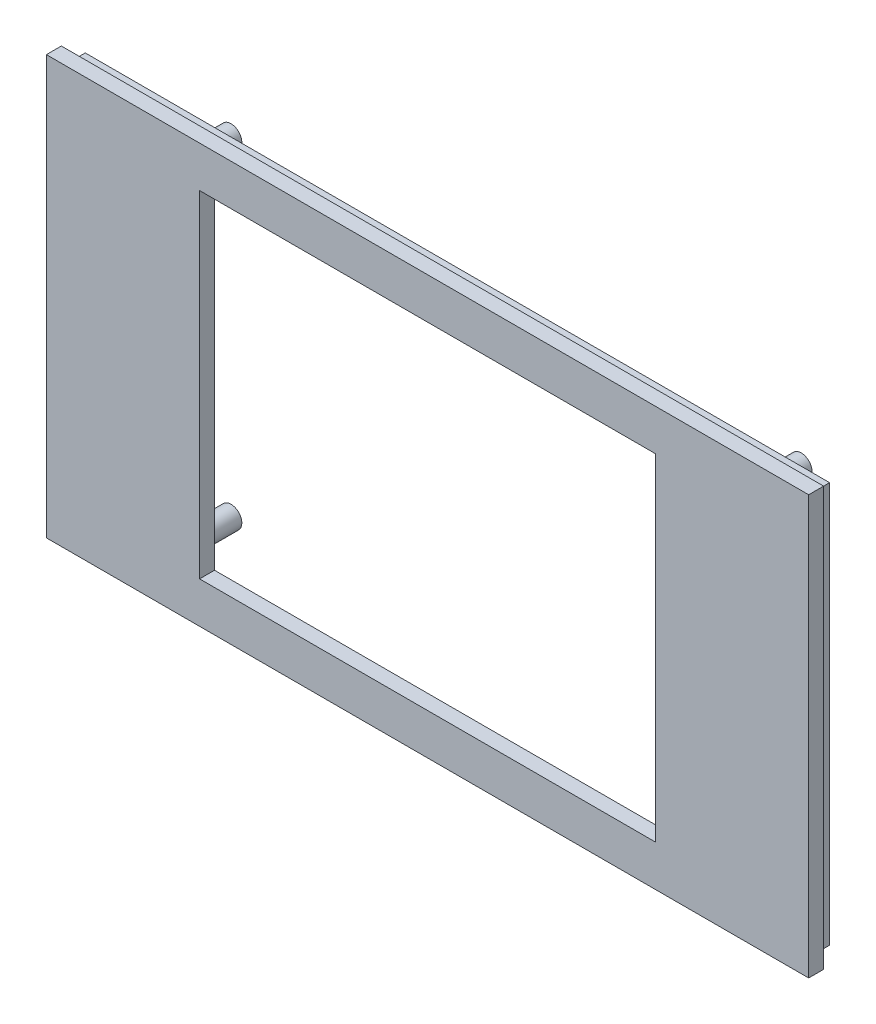
ISO-10303-21;
HEADER;
FILE_DESCRIPTION(('STEP AP214'),'2;1');
FILE_NAME('part.step','',(''),(''),'','','');
FILE_SCHEMA(('AUTOMOTIVE_DESIGN { 1 0 10303 214 1 1 1 1 }'));
ENDSEC;
DATA;
#1=APPLICATION_CONTEXT('core data for automotive mechanical design processes');
#2=APPLICATION_PROTOCOL_DEFINITION('international standard','automotive_design',2000,#1);
#3=PRODUCT_CONTEXT('',#1,'mechanical');
#4=PRODUCT('Part','Part','',(#3));
#5=PRODUCT_RELATED_PRODUCT_CATEGORY('part','',(#4));
#6=PRODUCT_DEFINITION_FORMATION('','',#4);
#7=PRODUCT_DEFINITION_CONTEXT('part definition',#1,'design');
#8=PRODUCT_DEFINITION('design','',#6,#7);
#9=PRODUCT_DEFINITION_SHAPE('','',#8);
#10=(LENGTH_UNIT() NAMED_UNIT(*) SI_UNIT(.MILLI.,.METRE.));
#11=(NAMED_UNIT(*) PLANE_ANGLE_UNIT() SI_UNIT($,.RADIAN.));
#12=(NAMED_UNIT(*) SI_UNIT($,.STERADIAN.) SOLID_ANGLE_UNIT());
#13=UNCERTAINTY_MEASURE_WITH_UNIT(LENGTH_MEASURE(1.E-05),#10,'distance_accuracy_value','');
#14=(GEOMETRIC_REPRESENTATION_CONTEXT(3) GLOBAL_UNCERTAINTY_ASSIGNED_CONTEXT((#13)) GLOBAL_UNIT_ASSIGNED_CONTEXT((#10,
#11,#12)) REPRESENTATION_CONTEXT('',''));
#15=CARTESIAN_POINT('',(0.,0.,0.));
#16=DIRECTION('',(0.,0.,1.));
#17=DIRECTION('',(1.,0.,0.));
#18=AXIS2_PLACEMENT_3D('',#15,#16,#17);
#19=CARTESIAN_POINT('',(0.,0.,0.));
#20=DIRECTION('',(0.,0.,-1.));
#21=DIRECTION('',(-1.,0.,0.));
#22=AXIS2_PLACEMENT_3D('',#19,#20,#21);
#23=PLANE('',#22);
#24=DIRECTION('',(0.,1.,0.));
#25=VECTOR('',#24,1.);
#26=CARTESIAN_POINT('',(51.,-28.,0.));
#27=LINE('',#26,#25);
#28=CARTESIAN_POINT('',(51.,-28.,0.));
#29=VERTEX_POINT('',#28);
#30=CARTESIAN_POINT('',(51.,28.,0.));
#31=VERTEX_POINT('',#30);
#32=EDGE_CURVE('E246',#29,#31,#27,.T.);
#33=ORIENTED_EDGE('',*,*,#32,.F.);
#34=DIRECTION('',(1.,0.,0.));
#35=VECTOR('',#34,1.);
#36=CARTESIAN_POINT('',(-51.,-28.,0.));
#37=LINE('',#36,#35);
#38=CARTESIAN_POINT('',(-51.,-28.,0.));
#39=VERTEX_POINT('',#38);
#40=EDGE_CURVE('E251',#39,#29,#37,.T.);
#41=ORIENTED_EDGE('',*,*,#40,.F.);
#42=DIRECTION('',(0.,-1.,0.));
#43=VECTOR('',#42,1.);
#44=CARTESIAN_POINT('',(-51.,-28.,0.));
#45=LINE('',#44,#43);
#46=CARTESIAN_POINT('',(-51.,28.,0.));
#47=VERTEX_POINT('',#46);
#48=EDGE_CURVE('E262',#47,#39,#45,.T.);
#49=ORIENTED_EDGE('',*,*,#48,.F.);
#50=DIRECTION('',(-1.,0.,0.));
#51=VECTOR('',#50,1.);
#52=CARTESIAN_POINT('',(-51.,28.,0.));
#53=LINE('',#52,#51);
#54=EDGE_CURVE('E260',#31,#47,#53,.T.);
#55=ORIENTED_EDGE('',*,*,#54,.F.);
#56=EDGE_LOOP('',(#33,#41,#49,#55));
#57=FACE_BOUND('',#56,.T.);
#58=DIRECTION('',(-1.,0.,0.));
#59=VECTOR('',#58,1.);
#60=CARTESIAN_POINT('',(49.8,-26.8,0.));
#61=LINE('',#60,#59);
#62=CARTESIAN_POINT('',(49.8,-26.8,0.));
#63=VERTEX_POINT('',#62);
#64=CARTESIAN_POINT('',(-49.8,-26.8,0.));
#65=VERTEX_POINT('',#64);
#66=EDGE_CURVE('E202',#63,#65,#61,.T.);
#67=ORIENTED_EDGE('',*,*,#66,.F.);
#68=DIRECTION('',(0.,-1.,0.));
#69=VECTOR('',#68,1.);
#70=CARTESIAN_POINT('',(49.8,26.8,0.));
#71=LINE('',#70,#69);
#72=CARTESIAN_POINT('',(49.8,26.8,0.));
#73=VERTEX_POINT('',#72);
#74=EDGE_CURVE('E165',#73,#63,#71,.T.);
#75=ORIENTED_EDGE('',*,*,#74,.F.);
#76=DIRECTION('',(1.,0.,0.));
#77=VECTOR('',#76,1.);
#78=CARTESIAN_POINT('',(49.8,26.8,0.));
#79=LINE('',#78,#77);
#80=CARTESIAN_POINT('',(-49.8,26.8,0.));
#81=VERTEX_POINT('',#80);
#82=EDGE_CURVE('E193',#81,#73,#79,.T.);
#83=ORIENTED_EDGE('',*,*,#82,.F.);
#84=DIRECTION('',(0.,1.,0.));
#85=VECTOR('',#84,1.);
#86=CARTESIAN_POINT('',(-49.8,26.8,0.));
#87=LINE('',#86,#85);
#88=EDGE_CURVE('E204',#65,#81,#87,.T.);
#89=ORIENTED_EDGE('',*,*,#88,.F.);
#90=EDGE_LOOP('',(#67,#75,#83,#89));
#91=FACE_BOUND('',#90,.T.);
#92=ADVANCED_FACE('F33',(#57,#91),#23,.T.);
#93=CARTESIAN_POINT('',(0.,0.,2.));
#94=DIRECTION('',(0.,0.,-1.));
#95=DIRECTION('',(-1.,0.,0.));
#96=AXIS2_PLACEMENT_3D('',#93,#94,#95);
#97=PLANE('',#96);
#98=DIRECTION('',(0.,1.,0.));
#99=VECTOR('',#98,1.);
#100=CARTESIAN_POINT('',(51.,-28.,2.));
#101=LINE('',#100,#99);
#102=CARTESIAN_POINT('',(51.,-28.,2.));
#103=VERTEX_POINT('',#102);
#104=CARTESIAN_POINT('',(51.,28.,2.));
#105=VERTEX_POINT('',#104);
#106=EDGE_CURVE('E247',#103,#105,#101,.T.);
#107=ORIENTED_EDGE('',*,*,#106,.T.);
#108=DIRECTION('',(-1.,0.,0.));
#109=VECTOR('',#108,1.);
#110=CARTESIAN_POINT('',(-51.,28.,2.));
#111=LINE('',#110,#109);
#112=CARTESIAN_POINT('',(-51.,28.,2.));
#113=VERTEX_POINT('',#112);
#114=EDGE_CURVE('E250',#105,#113,#111,.T.);
#115=ORIENTED_EDGE('',*,*,#114,.T.);
#116=DIRECTION('',(0.,-1.,0.));
#117=VECTOR('',#116,1.);
#118=CARTESIAN_POINT('',(-51.,-28.,2.));
#119=LINE('',#118,#117);
#120=CARTESIAN_POINT('',(-51.,-28.,2.));
#121=VERTEX_POINT('',#120);
#122=EDGE_CURVE('E253',#113,#121,#119,.T.);
#123=ORIENTED_EDGE('',*,*,#122,.T.);
#124=DIRECTION('',(1.,0.,0.));
#125=VECTOR('',#124,1.);
#126=CARTESIAN_POINT('',(-51.,-28.,2.));
#127=LINE('',#126,#125);
#128=EDGE_CURVE('E255',#121,#103,#127,.T.);
#129=ORIENTED_EDGE('',*,*,#128,.T.);
#130=EDGE_LOOP('',(#107,#115,#123,#129));
#131=FACE_BOUND('',#130,.T.);
#132=DIRECTION('',(0.,1.,0.));
#133=VECTOR('',#132,1.);
#134=CARTESIAN_POINT('',(30.5,-22.5,2.));
#135=LINE('',#134,#133);
#136=CARTESIAN_POINT('',(30.5,-22.5,2.));
#137=VERTEX_POINT('',#136);
#138=CARTESIAN_POINT('',(30.5,22.5,2.));
#139=VERTEX_POINT('',#138);
#140=EDGE_CURVE('E216',#137,#139,#135,.T.);
#141=ORIENTED_EDGE('',*,*,#140,.F.);
#142=DIRECTION('',(1.,0.,0.));
#143=VECTOR('',#142,1.);
#144=CARTESIAN_POINT('',(-30.5,-22.5,2.));
#145=LINE('',#144,#143);
#146=CARTESIAN_POINT('',(-30.5,-22.5,2.));
#147=VERTEX_POINT('',#146);
#148=EDGE_CURVE('E224',#147,#137,#145,.T.);
#149=ORIENTED_EDGE('',*,*,#148,.F.);
#150=DIRECTION('',(0.,-1.,0.));
#151=VECTOR('',#150,1.);
#152=CARTESIAN_POINT('',(-30.5,-22.5,2.));
#153=LINE('',#152,#151);
#154=CARTESIAN_POINT('',(-30.5,22.5,2.));
#155=VERTEX_POINT('',#154);
#156=EDGE_CURVE('E221',#155,#147,#153,.T.);
#157=ORIENTED_EDGE('',*,*,#156,.F.);
#158=DIRECTION('',(-1.,0.,0.));
#159=VECTOR('',#158,1.);
#160=CARTESIAN_POINT('',(-30.5,22.5,2.));
#161=LINE('',#160,#159);
#162=EDGE_CURVE('E218',#139,#155,#161,.T.);
#163=ORIENTED_EDGE('',*,*,#162,.F.);
#164=EDGE_LOOP('',(#141,#149,#157,#163));
#165=FACE_BOUND('',#164,.T.);
#166=ADVANCED_FACE('F289',(#131,#165),#97,.F.);
#167=CARTESIAN_POINT('',(-35.3,-22.2,0.));
#168=DIRECTION('',(0.,0.,-1.));
#169=DIRECTION('',(-1.,0.,0.));
#170=AXIS2_PLACEMENT_3D('',#167,#168,#169);
#171=CIRCLE('',#170,1.45);
#172=CARTESIAN_POINT('',(-36.75,-22.2,0.));
#173=VERTEX_POINT('',#172);
#174=EDGE_CURVE('E313',#173,#173,#171,.T.);
#175=ORIENTED_EDGE('',*,*,#174,.F.);
#176=EDGE_LOOP('',(#175));
#177=FACE_BOUND('',#176,.T.);
#178=CARTESIAN_POINT('',(41.,-22.2,0.));
#179=DIRECTION('',(0.,0.,-1.));
#180=DIRECTION('',(-1.,0.,0.));
#181=AXIS2_PLACEMENT_3D('',#178,#179,#180);
#182=CIRCLE('',#181,1.45);
#183=CARTESIAN_POINT('',(39.55,-22.2,0.));
#184=VERTEX_POINT('',#183);
#185=EDGE_CURVE('E317',#184,#184,#182,.T.);
#186=ORIENTED_EDGE('',*,*,#185,.F.);
#187=EDGE_LOOP('',(#186));
#188=FACE_BOUND('',#187,.T.);
#189=CARTESIAN_POINT('',(-35.3,21.9,0.));
#190=DIRECTION('',(0.,0.,-1.));
#191=DIRECTION('',(-1.,0.,0.));
#192=AXIS2_PLACEMENT_3D('',#189,#190,#191);
#193=CIRCLE('',#192,1.45);
#194=CARTESIAN_POINT('',(-36.75,21.9,0.));
#195=VERTEX_POINT('',#194);
#196=EDGE_CURVE('E321',#195,#195,#193,.T.);
#197=ORIENTED_EDGE('',*,*,#196,.F.);
#198=EDGE_LOOP('',(#197));
#199=FACE_BOUND('',#198,.T.);
#200=CARTESIAN_POINT('',(41.,21.9,0.));
#201=DIRECTION('',(0.,0.,-1.));
#202=DIRECTION('',(-1.,0.,0.));
#203=AXIS2_PLACEMENT_3D('',#200,#201,#202);
#204=CIRCLE('',#203,1.45);
#205=CARTESIAN_POINT('',(39.55,21.9,0.));
#206=VERTEX_POINT('',#205);
#207=EDGE_CURVE('E324',#206,#206,#204,.T.);
#208=ORIENTED_EDGE('',*,*,#207,.F.);
#209=EDGE_LOOP('',(#208));
#210=FACE_BOUND('',#209,.T.);
#211=DIRECTION('',(0.,1.,0.));
#212=VECTOR('',#211,1.);
#213=CARTESIAN_POINT('',(-48.6,25.6,0.));
#214=LINE('',#213,#212);
#215=CARTESIAN_POINT('',(-48.6,-25.6,0.));
#216=VERTEX_POINT('',#215);
#217=CARTESIAN_POINT('',(-48.6,25.6,0.));
#218=VERTEX_POINT('',#217);
#219=EDGE_CURVE('E56',#216,#218,#214,.T.);
#220=ORIENTED_EDGE('',*,*,#219,.T.);
#221=DIRECTION('',(1.,0.,0.));
#222=VECTOR('',#221,1.);
#223=CARTESIAN_POINT('',(-48.6,25.6,0.));
#224=LINE('',#223,#222);
#225=CARTESIAN_POINT('',(48.6,25.6,0.));
#226=VERTEX_POINT('',#225);
#227=EDGE_CURVE('E164',#218,#226,#224,.T.);
#228=ORIENTED_EDGE('',*,*,#227,.T.);
#229=DIRECTION('',(0.,-1.,0.));
#230=VECTOR('',#229,1.);
#231=CARTESIAN_POINT('',(48.6,25.6,0.));
#232=LINE('',#231,#230);
#233=CARTESIAN_POINT('',(48.6,-25.6,0.));
#234=VERTEX_POINT('',#233);
#235=EDGE_CURVE('E181',#226,#234,#232,.T.);
#236=ORIENTED_EDGE('',*,*,#235,.T.);
#237=DIRECTION('',(-1.,0.,0.));
#238=VECTOR('',#237,1.);
#239=CARTESIAN_POINT('',(-48.6,-25.6,0.));
#240=LINE('',#239,#238);
#241=EDGE_CURVE('E158',#234,#216,#240,.T.);
#242=ORIENTED_EDGE('',*,*,#241,.T.);
#243=EDGE_LOOP('',(#220,#228,#236,#242));
#244=FACE_BOUND('',#243,.T.);
#245=DIRECTION('',(1.,0.,0.));
#246=VECTOR('',#245,1.);
#247=CARTESIAN_POINT('',(-30.5,-22.5,0.));
#248=LINE('',#247,#246);
#249=CARTESIAN_POINT('',(-30.5,-22.5,0.));
#250=VERTEX_POINT('',#249);
#251=CARTESIAN_POINT('',(30.5,-22.5,0.));
#252=VERTEX_POINT('',#251);
#253=EDGE_CURVE('E219',#250,#252,#248,.T.);
#254=ORIENTED_EDGE('',*,*,#253,.T.);
#255=DIRECTION('',(0.,1.,0.));
#256=VECTOR('',#255,1.);
#257=CARTESIAN_POINT('',(30.5,-22.5,0.));
#258=LINE('',#257,#256);
#259=CARTESIAN_POINT('',(30.5,22.5,0.));
#260=VERTEX_POINT('',#259);
#261=EDGE_CURVE('E215',#252,#260,#258,.T.);
#262=ORIENTED_EDGE('',*,*,#261,.T.);
#263=DIRECTION('',(-1.,0.,0.));
#264=VECTOR('',#263,1.);
#265=CARTESIAN_POINT('',(-30.5,22.5,0.));
#266=LINE('',#265,#264);
#267=CARTESIAN_POINT('',(-30.5,22.5,0.));
#268=VERTEX_POINT('',#267);
#269=EDGE_CURVE('E229',#260,#268,#266,.T.);
#270=ORIENTED_EDGE('',*,*,#269,.T.);
#271=DIRECTION('',(0.,-1.,0.));
#272=VECTOR('',#271,1.);
#273=CARTESIAN_POINT('',(-30.5,-22.5,0.));
#274=LINE('',#273,#272);
#275=EDGE_CURVE('E232',#268,#250,#274,.T.);
#276=ORIENTED_EDGE('',*,*,#275,.T.);
#277=EDGE_LOOP('',(#254,#262,#270,#276));
#278=FACE_BOUND('',#277,.T.);
#279=ADVANCED_FACE('F298',(#177,#188,#199,#210,#244,#278),#23,.T.);
#280=CARTESIAN_POINT('',(51.,-28.,2.));
#281=DIRECTION('',(-1.,0.,0.));
#282=DIRECTION('',(0.,0.,1.));
#283=AXIS2_PLACEMENT_3D('',#280,#281,#282);
#284=PLANE('',#283);
#285=ORIENTED_EDGE('',*,*,#32,.T.);
#286=DIRECTION('',(0.,0.,-1.));
#287=VECTOR('',#286,1.);
#288=CARTESIAN_POINT('',(51.,28.,2.));
#289=LINE('',#288,#287);
#290=EDGE_CURVE('E11',#105,#31,#289,.T.);
#291=ORIENTED_EDGE('',*,*,#290,.F.);
#292=ORIENTED_EDGE('',*,*,#106,.F.);
#293=DIRECTION('',(0.,0.,-1.));
#294=VECTOR('',#293,1.);
#295=CARTESIAN_POINT('',(51.,-28.,2.));
#296=LINE('',#295,#294);
#297=EDGE_CURVE('E257',#103,#29,#296,.T.);
#298=ORIENTED_EDGE('',*,*,#297,.T.);
#299=EDGE_LOOP('',(#285,#291,#292,#298));
#300=FACE_BOUND('',#299,.T.);
#301=ADVANCED_FACE('F35',(#300),#284,.F.);
#302=CARTESIAN_POINT('',(-51.,28.,2.));
#303=DIRECTION('',(0.,-1.,0.));
#304=DIRECTION('',(0.,0.,-1.));
#305=AXIS2_PLACEMENT_3D('',#302,#303,#304);
#306=PLANE('',#305);
#307=ORIENTED_EDGE('',*,*,#54,.T.);
#308=DIRECTION('',(0.,0.,-1.));
#309=VECTOR('',#308,1.);
#310=CARTESIAN_POINT('',(-51.,28.,2.));
#311=LINE('',#310,#309);
#312=EDGE_CURVE('E41',#113,#47,#311,.T.);
#313=ORIENTED_EDGE('',*,*,#312,.F.);
#314=ORIENTED_EDGE('',*,*,#114,.F.);
#315=ORIENTED_EDGE('',*,*,#290,.T.);
#316=EDGE_LOOP('',(#307,#313,#314,#315));
#317=FACE_BOUND('',#316,.T.);
#318=ADVANCED_FACE('F291',(#317),#306,.F.);
#319=CARTESIAN_POINT('',(-51.,-28.,2.));
#320=DIRECTION('',(1.,0.,0.));
#321=DIRECTION('',(0.,0.,-1.));
#322=AXIS2_PLACEMENT_3D('',#319,#320,#321);
#323=PLANE('',#322);
#324=ORIENTED_EDGE('',*,*,#48,.T.);
#325=DIRECTION('',(0.,0.,-1.));
#326=VECTOR('',#325,1.);
#327=CARTESIAN_POINT('',(-51.,-28.,2.));
#328=LINE('',#327,#326);
#329=EDGE_CURVE('E267',#121,#39,#328,.T.);
#330=ORIENTED_EDGE('',*,*,#329,.F.);
#331=ORIENTED_EDGE('',*,*,#122,.F.);
#332=ORIENTED_EDGE('',*,*,#312,.T.);
#333=EDGE_LOOP('',(#324,#330,#331,#332));
#334=FACE_BOUND('',#333,.T.);
#335=ADVANCED_FACE('F274',(#334),#323,.F.);
#336=CARTESIAN_POINT('',(-51.,-28.,2.));
#337=DIRECTION('',(0.,1.,0.));
#338=DIRECTION('',(0.,0.,1.));
#339=AXIS2_PLACEMENT_3D('',#336,#337,#338);
#340=PLANE('',#339);
#341=ORIENTED_EDGE('',*,*,#40,.T.);
#342=ORIENTED_EDGE('',*,*,#297,.F.);
#343=ORIENTED_EDGE('',*,*,#128,.F.);
#344=ORIENTED_EDGE('',*,*,#329,.T.);
#345=EDGE_LOOP('',(#341,#342,#343,#344));
#346=FACE_BOUND('',#345,.T.);
#347=ADVANCED_FACE('F283',(#346),#340,.F.);
#348=CARTESIAN_POINT('',(30.5,-22.5,2.));
#349=DIRECTION('',(-1.,0.,0.));
#350=DIRECTION('',(0.,0.,1.));
#351=AXIS2_PLACEMENT_3D('',#348,#349,#350);
#352=PLANE('',#351);
#353=ORIENTED_EDGE('',*,*,#261,.F.);
#354=DIRECTION('',(0.,0.,-1.));
#355=VECTOR('',#354,1.);
#356=CARTESIAN_POINT('',(30.5,-22.5,2.));
#357=LINE('',#356,#355);
#358=EDGE_CURVE('E226',#137,#252,#357,.T.);
#359=ORIENTED_EDGE('',*,*,#358,.F.);
#360=ORIENTED_EDGE('',*,*,#140,.T.);
#361=DIRECTION('',(0.,0.,-1.));
#362=VECTOR('',#361,1.);
#363=CARTESIAN_POINT('',(30.5,22.5,2.));
#364=LINE('',#363,#362);
#365=EDGE_CURVE('E243',#139,#260,#364,.T.);
#366=ORIENTED_EDGE('',*,*,#365,.T.);
#367=EDGE_LOOP('',(#353,#359,#360,#366));
#368=FACE_BOUND('',#367,.T.);
#369=ADVANCED_FACE('F334',(#368),#352,.T.);
#370=CARTESIAN_POINT('',(-30.5,22.5,2.));
#371=DIRECTION('',(0.,-1.,0.));
#372=DIRECTION('',(0.,0.,-1.));
#373=AXIS2_PLACEMENT_3D('',#370,#371,#372);
#374=PLANE('',#373);
#375=ORIENTED_EDGE('',*,*,#269,.F.);
#376=ORIENTED_EDGE('',*,*,#365,.F.);
#377=ORIENTED_EDGE('',*,*,#162,.T.);
#378=DIRECTION('',(0.,0.,-1.));
#379=VECTOR('',#378,1.);
#380=CARTESIAN_POINT('',(-30.5,22.5,2.));
#381=LINE('',#380,#379);
#382=EDGE_CURVE('E241',#155,#268,#381,.T.);
#383=ORIENTED_EDGE('',*,*,#382,.T.);
#384=EDGE_LOOP('',(#375,#376,#377,#383));
#385=FACE_BOUND('',#384,.T.);
#386=ADVANCED_FACE('F340',(#385),#374,.T.);
#387=CARTESIAN_POINT('',(-30.5,-22.5,2.));
#388=DIRECTION('',(1.,0.,0.));
#389=DIRECTION('',(0.,0.,-1.));
#390=AXIS2_PLACEMENT_3D('',#387,#388,#389);
#391=PLANE('',#390);
#392=ORIENTED_EDGE('',*,*,#275,.F.);
#393=ORIENTED_EDGE('',*,*,#382,.F.);
#394=ORIENTED_EDGE('',*,*,#156,.T.);
#395=DIRECTION('',(0.,0.,-1.));
#396=VECTOR('',#395,1.);
#397=CARTESIAN_POINT('',(-30.5,-22.5,2.));
#398=LINE('',#397,#396);
#399=EDGE_CURVE('E239',#147,#250,#398,.T.);
#400=ORIENTED_EDGE('',*,*,#399,.T.);
#401=EDGE_LOOP('',(#392,#393,#394,#400));
#402=FACE_BOUND('',#401,.T.);
#403=ADVANCED_FACE('F342',(#402),#391,.T.);
#404=CARTESIAN_POINT('',(-30.5,-22.5,2.));
#405=DIRECTION('',(0.,1.,0.));
#406=DIRECTION('',(0.,0.,1.));
#407=AXIS2_PLACEMENT_3D('',#404,#405,#406);
#408=PLANE('',#407);
#409=ORIENTED_EDGE('',*,*,#253,.F.);
#410=ORIENTED_EDGE('',*,*,#399,.F.);
#411=ORIENTED_EDGE('',*,*,#148,.T.);
#412=ORIENTED_EDGE('',*,*,#358,.T.);
#413=EDGE_LOOP('',(#409,#410,#411,#412));
#414=FACE_BOUND('',#413,.T.);
#415=ADVANCED_FACE('F329',(#414),#408,.T.);
#416=CARTESIAN_POINT('',(0.,0.,-2.));
#417=DIRECTION('',(0.,0.,-1.));
#418=DIRECTION('',(-1.,0.,0.));
#419=AXIS2_PLACEMENT_3D('',#416,#417,#418);
#420=PLANE('',#419);
#421=DIRECTION('',(0.,-1.,0.));
#422=VECTOR('',#421,1.);
#423=CARTESIAN_POINT('',(49.8,26.8,-2.));
#424=LINE('',#423,#422);
#425=CARTESIAN_POINT('',(49.8,26.8,-2.));
#426=VERTEX_POINT('',#425);
#427=CARTESIAN_POINT('',(49.8,-26.8,-2.));
#428=VERTEX_POINT('',#427);
#429=EDGE_CURVE('E189',#426,#428,#424,.T.);
#430=ORIENTED_EDGE('',*,*,#429,.T.);
#431=DIRECTION('',(-1.,0.,0.));
#432=VECTOR('',#431,1.);
#433=CARTESIAN_POINT('',(49.8,-26.8,-2.));
#434=LINE('',#433,#432);
#435=CARTESIAN_POINT('',(-49.8,-26.8,-2.));
#436=VERTEX_POINT('',#435);
#437=EDGE_CURVE('E192',#428,#436,#434,.T.);
#438=ORIENTED_EDGE('',*,*,#437,.T.);
#439=DIRECTION('',(0.,1.,0.));
#440=VECTOR('',#439,1.);
#441=CARTESIAN_POINT('',(-49.8,26.8,-2.));
#442=LINE('',#441,#440);
#443=CARTESIAN_POINT('',(-49.8,26.8,-2.));
#444=VERTEX_POINT('',#443);
#445=EDGE_CURVE('E195',#436,#444,#442,.T.);
#446=ORIENTED_EDGE('',*,*,#445,.T.);
#447=DIRECTION('',(1.,0.,0.));
#448=VECTOR('',#447,1.);
#449=CARTESIAN_POINT('',(49.8,26.8,-2.));
#450=LINE('',#449,#448);
#451=EDGE_CURVE('E197',#444,#426,#450,.T.);
#452=ORIENTED_EDGE('',*,*,#451,.T.);
#453=EDGE_LOOP('',(#430,#438,#446,#452));
#454=FACE_BOUND('',#453,.T.);
#455=DIRECTION('',(1.,0.,0.));
#456=VECTOR('',#455,1.);
#457=CARTESIAN_POINT('',(-48.6,25.6,-2.));
#458=LINE('',#457,#456);
#459=CARTESIAN_POINT('',(-48.6,25.6,-2.));
#460=VERTEX_POINT('',#459);
#461=CARTESIAN_POINT('',(48.6,25.6,-2.));
#462=VERTEX_POINT('',#461);
#463=EDGE_CURVE('E157',#460,#462,#458,.T.);
#464=ORIENTED_EDGE('',*,*,#463,.F.);
#465=DIRECTION('',(0.,1.,0.));
#466=VECTOR('',#465,1.);
#467=CARTESIAN_POINT('',(-48.6,25.6,-2.));
#468=LINE('',#467,#466);
#469=CARTESIAN_POINT('',(-48.6,-25.6,-2.));
#470=VERTEX_POINT('',#469);
#471=EDGE_CURVE('E148',#470,#460,#468,.T.);
#472=ORIENTED_EDGE('',*,*,#471,.F.);
#473=DIRECTION('',(-1.,0.,0.));
#474=VECTOR('',#473,1.);
#475=CARTESIAN_POINT('',(-48.6,-25.6,-2.));
#476=LINE('',#475,#474);
#477=CARTESIAN_POINT('',(48.6,-25.6,-2.));
#478=VERTEX_POINT('',#477);
#479=EDGE_CURVE('E173',#478,#470,#476,.T.);
#480=ORIENTED_EDGE('',*,*,#479,.F.);
#481=DIRECTION('',(0.,-1.,0.));
#482=VECTOR('',#481,1.);
#483=CARTESIAN_POINT('',(48.6,25.6,-2.));
#484=LINE('',#483,#482);
#485=EDGE_CURVE('E171',#462,#478,#484,.T.);
#486=ORIENTED_EDGE('',*,*,#485,.F.);
#487=EDGE_LOOP('',(#464,#472,#480,#486));
#488=FACE_BOUND('',#487,.T.);
#489=ADVANCED_FACE('F169',(#454,#488),#420,.T.);
#490=CARTESIAN_POINT('',(49.8,26.8,-2.));
#491=DIRECTION('',(-1.,0.,0.));
#492=DIRECTION('',(0.,-1.,0.));
#493=AXIS2_PLACEMENT_3D('',#490,#491,#492);
#494=PLANE('',#493);
#495=ORIENTED_EDGE('',*,*,#74,.T.);
#496=DIRECTION('',(0.,0.,1.));
#497=VECTOR('',#496,1.);
#498=CARTESIAN_POINT('',(49.8,-26.8,-2.));
#499=LINE('',#498,#497);
#500=EDGE_CURVE('E213',#428,#63,#499,.T.);
#501=ORIENTED_EDGE('',*,*,#500,.F.);
#502=ORIENTED_EDGE('',*,*,#429,.F.);
#503=DIRECTION('',(0.,0.,1.));
#504=VECTOR('',#503,1.);
#505=CARTESIAN_POINT('',(49.8,26.8,-2.));
#506=LINE('',#505,#504);
#507=EDGE_CURVE('E199',#426,#73,#506,.T.);
#508=ORIENTED_EDGE('',*,*,#507,.T.);
#509=EDGE_LOOP('',(#495,#501,#502,#508));
#510=FACE_BOUND('',#509,.T.);
#511=ADVANCED_FACE('F488',(#510),#494,.F.);
#512=CARTESIAN_POINT('',(49.8,-26.8,-2.));
#513=DIRECTION('',(0.,1.,0.));
#514=DIRECTION('',(0.,0.,1.));
#515=AXIS2_PLACEMENT_3D('',#512,#513,#514);
#516=PLANE('',#515);
#517=ORIENTED_EDGE('',*,*,#66,.T.);
#518=DIRECTION('',(0.,0.,1.));
#519=VECTOR('',#518,1.);
#520=CARTESIAN_POINT('',(-49.8,-26.8,-2.));
#521=LINE('',#520,#519);
#522=EDGE_CURVE('E210',#436,#65,#521,.T.);
#523=ORIENTED_EDGE('',*,*,#522,.F.);
#524=ORIENTED_EDGE('',*,*,#437,.F.);
#525=ORIENTED_EDGE('',*,*,#500,.T.);
#526=EDGE_LOOP('',(#517,#523,#524,#525));
#527=FACE_BOUND('',#526,.T.);
#528=ADVANCED_FACE('F495',(#527),#516,.F.);
#529=CARTESIAN_POINT('',(-49.8,26.8,-2.));
#530=DIRECTION('',(1.,0.,0.));
#531=DIRECTION('',(0.,1.,0.));
#532=AXIS2_PLACEMENT_3D('',#529,#530,#531);
#533=PLANE('',#532);
#534=ORIENTED_EDGE('',*,*,#88,.T.);
#535=DIRECTION('',(0.,0.,1.));
#536=VECTOR('',#535,1.);
#537=CARTESIAN_POINT('',(-49.8,26.8,-2.));
#538=LINE('',#537,#536);
#539=EDGE_CURVE('E48',#444,#81,#538,.T.);
#540=ORIENTED_EDGE('',*,*,#539,.F.);
#541=ORIENTED_EDGE('',*,*,#445,.F.);
#542=ORIENTED_EDGE('',*,*,#522,.T.);
#543=EDGE_LOOP('',(#534,#540,#541,#542));
#544=FACE_BOUND('',#543,.T.);
#545=ADVANCED_FACE('F492',(#544),#533,.F.);
#546=CARTESIAN_POINT('',(49.8,26.8,-2.));
#547=DIRECTION('',(0.,-1.,0.));
#548=DIRECTION('',(0.,0.,-1.));
#549=AXIS2_PLACEMENT_3D('',#546,#547,#548);
#550=PLANE('',#549);
#551=ORIENTED_EDGE('',*,*,#82,.T.);
#552=ORIENTED_EDGE('',*,*,#507,.F.);
#553=ORIENTED_EDGE('',*,*,#451,.F.);
#554=ORIENTED_EDGE('',*,*,#539,.T.);
#555=EDGE_LOOP('',(#551,#552,#553,#554));
#556=FACE_BOUND('',#555,.T.);
#557=ADVANCED_FACE('F485',(#556),#550,.F.);
#558=CARTESIAN_POINT('',(-48.6,25.6,-2.));
#559=DIRECTION('',(1.,0.,0.));
#560=DIRECTION('',(0.,1.,0.));
#561=AXIS2_PLACEMENT_3D('',#558,#559,#560);
#562=PLANE('',#561);
#563=ORIENTED_EDGE('',*,*,#219,.F.);
#564=DIRECTION('',(0.,0.,1.));
#565=VECTOR('',#564,1.);
#566=CARTESIAN_POINT('',(-48.6,-25.6,-2.));
#567=LINE('',#566,#565);
#568=EDGE_CURVE('E153',#470,#216,#567,.T.);
#569=ORIENTED_EDGE('',*,*,#568,.F.);
#570=ORIENTED_EDGE('',*,*,#471,.T.);
#571=DIRECTION('',(0.,0.,1.));
#572=VECTOR('',#571,1.);
#573=CARTESIAN_POINT('',(-48.6,25.6,-2.));
#574=LINE('',#573,#572);
#575=EDGE_CURVE('E151',#460,#218,#574,.T.);
#576=ORIENTED_EDGE('',*,*,#575,.T.);
#577=EDGE_LOOP('',(#563,#569,#570,#576));
#578=FACE_BOUND('',#577,.T.);
#579=ADVANCED_FACE('F150',(#578),#562,.T.);
#580=CARTESIAN_POINT('',(-48.6,25.6,-2.));
#581=DIRECTION('',(0.,-1.,0.));
#582=DIRECTION('',(1.,0.,0.));
#583=AXIS2_PLACEMENT_3D('',#580,#581,#582);
#584=PLANE('',#583);
#585=ORIENTED_EDGE('',*,*,#227,.F.);
#586=ORIENTED_EDGE('',*,*,#575,.F.);
#587=ORIENTED_EDGE('',*,*,#463,.T.);
#588=DIRECTION('',(0.,0.,1.));
#589=VECTOR('',#588,1.);
#590=CARTESIAN_POINT('',(48.6,25.6,-2.));
#591=LINE('',#590,#589);
#592=EDGE_CURVE('E166',#462,#226,#591,.T.);
#593=ORIENTED_EDGE('',*,*,#592,.T.);
#594=EDGE_LOOP('',(#585,#586,#587,#593));
#595=FACE_BOUND('',#594,.T.);
#596=ADVANCED_FACE('F161',(#595),#584,.T.);
#597=CARTESIAN_POINT('',(48.6,25.6,-2.));
#598=DIRECTION('',(-1.,0.,0.));
#599=DIRECTION('',(0.,-1.,0.));
#600=AXIS2_PLACEMENT_3D('',#597,#598,#599);
#601=PLANE('',#600);
#602=ORIENTED_EDGE('',*,*,#235,.F.);
#603=ORIENTED_EDGE('',*,*,#592,.F.);
#604=ORIENTED_EDGE('',*,*,#485,.T.);
#605=DIRECTION('',(0.,0.,1.));
#606=VECTOR('',#605,1.);
#607=CARTESIAN_POINT('',(48.6,-25.6,-2.));
#608=LINE('',#607,#606);
#609=EDGE_CURVE('E185',#478,#234,#608,.T.);
#610=ORIENTED_EDGE('',*,*,#609,.T.);
#611=EDGE_LOOP('',(#602,#603,#604,#610));
#612=FACE_BOUND('',#611,.T.);
#613=ADVANCED_FACE('F476',(#612),#601,.T.);
#614=CARTESIAN_POINT('',(-48.6,-25.6,-2.));
#615=DIRECTION('',(0.,1.,0.));
#616=DIRECTION('',(-1.,0.,0.));
#617=AXIS2_PLACEMENT_3D('',#614,#615,#616);
#618=PLANE('',#617);
#619=ORIENTED_EDGE('',*,*,#241,.F.);
#620=ORIENTED_EDGE('',*,*,#609,.F.);
#621=ORIENTED_EDGE('',*,*,#479,.T.);
#622=ORIENTED_EDGE('',*,*,#568,.T.);
#623=EDGE_LOOP('',(#619,#620,#621,#622));
#624=FACE_BOUND('',#623,.T.);
#625=ADVANCED_FACE('F389',(#624),#618,.T.);
#626=CARTESIAN_POINT('',(41.,21.9,-7.));
#627=DIRECTION('',(0.,0.,1.));
#628=DIRECTION('',(1.,0.,0.));
#629=AXIS2_PLACEMENT_3D('',#626,#627,#628);
#630=CYLINDRICAL_SURFACE('',#629,1.45);
#631=CARTESIAN_POINT('',(41.,21.9,-7.));
#632=DIRECTION('',(0.,0.,-1.));
#633=DIRECTION('',(-1.,0.,0.));
#634=AXIS2_PLACEMENT_3D('',#631,#632,#633);
#635=CIRCLE('',#634,1.45);
#636=CARTESIAN_POINT('',(39.55,21.9,-7.));
#637=VERTEX_POINT('',#636);
#638=EDGE_CURVE('E179',#637,#637,#635,.T.);
#639=ORIENTED_EDGE('',*,*,#638,.F.);
#640=EDGE_LOOP('',(#639));
#641=FACE_BOUND('',#640,.T.);
#642=ORIENTED_EDGE('',*,*,#207,.T.);
#643=EDGE_LOOP('',(#642));
#644=FACE_BOUND('',#643,.T.);
#645=ADVANCED_FACE('F394',(#641,#644),#630,.T.);
#646=CARTESIAN_POINT('',(41.,21.9,-7.));
#647=DIRECTION('',(0.,0.,-1.));
#648=DIRECTION('',(-1.,0.,0.));
#649=AXIS2_PLACEMENT_3D('',#646,#647,#648);
#650=PLANE('',#649);
#651=ORIENTED_EDGE('',*,*,#638,.T.);
#652=EDGE_LOOP('',(#651));
#653=FACE_BOUND('',#652,.T.);
#654=ADVANCED_FACE('F399',(#653),#650,.T.);
#655=CARTESIAN_POINT('',(-35.3,21.9,-7.));
#656=DIRECTION('',(0.,0.,1.));
#657=DIRECTION('',(1.,0.,0.));
#658=AXIS2_PLACEMENT_3D('',#655,#656,#657);
#659=CYLINDRICAL_SURFACE('',#658,1.45);
#660=CARTESIAN_POINT('',(-35.3,21.9,-7.));
#661=DIRECTION('',(0.,0.,-1.));
#662=DIRECTION('',(-1.,0.,0.));
#663=AXIS2_PLACEMENT_3D('',#660,#661,#662);
#664=CIRCLE('',#663,1.45);
#665=CARTESIAN_POINT('',(-36.75,21.9,-7.));
#666=VERTEX_POINT('',#665);
#667=EDGE_CURVE('E597',#666,#666,#664,.T.);
#668=ORIENTED_EDGE('',*,*,#667,.F.);
#669=EDGE_LOOP('',(#668));
#670=FACE_BOUND('',#669,.T.);
#671=ORIENTED_EDGE('',*,*,#196,.T.);
#672=EDGE_LOOP('',(#671));
#673=FACE_BOUND('',#672,.T.);
#674=ADVANCED_FACE('F409',(#670,#673),#659,.T.);
#675=CARTESIAN_POINT('',(-35.3,21.9,-7.));
#676=DIRECTION('',(0.,0.,-1.));
#677=DIRECTION('',(-1.,0.,0.));
#678=AXIS2_PLACEMENT_3D('',#675,#676,#677);
#679=PLANE('',#678);
#680=ORIENTED_EDGE('',*,*,#667,.T.);
#681=EDGE_LOOP('',(#680));
#682=FACE_BOUND('',#681,.T.);
#683=ADVANCED_FACE('F419',(#682),#679,.T.);
#684=CARTESIAN_POINT('',(41.,-22.2,-7.));
#685=DIRECTION('',(0.,0.,1.));
#686=DIRECTION('',(1.,0.,0.));
#687=AXIS2_PLACEMENT_3D('',#684,#685,#686);
#688=CYLINDRICAL_SURFACE('',#687,1.45);
#689=CARTESIAN_POINT('',(41.,-22.2,-7.));
#690=DIRECTION('',(0.,0.,-1.));
#691=DIRECTION('',(-1.,0.,0.));
#692=AXIS2_PLACEMENT_3D('',#689,#690,#691);
#693=CIRCLE('',#692,1.45);
#694=CARTESIAN_POINT('',(39.55,-22.2,-7.));
#695=VERTEX_POINT('',#694);
#696=EDGE_CURVE('E591',#695,#695,#693,.T.);
#697=ORIENTED_EDGE('',*,*,#696,.F.);
#698=EDGE_LOOP('',(#697));
#699=FACE_BOUND('',#698,.T.);
#700=ORIENTED_EDGE('',*,*,#185,.T.);
#701=EDGE_LOOP('',(#700));
#702=FACE_BOUND('',#701,.T.);
#703=ADVANCED_FACE('F429',(#699,#702),#688,.T.);
#704=CARTESIAN_POINT('',(41.,-22.2,-7.));
#705=DIRECTION('',(0.,0.,-1.));
#706=DIRECTION('',(-1.,0.,0.));
#707=AXIS2_PLACEMENT_3D('',#704,#705,#706);
#708=PLANE('',#707);
#709=ORIENTED_EDGE('',*,*,#696,.T.);
#710=EDGE_LOOP('',(#709));
#711=FACE_BOUND('',#710,.T.);
#712=ADVANCED_FACE('F439',(#711),#708,.T.);
#713=CARTESIAN_POINT('',(-35.3,-22.2,-7.));
#714=DIRECTION('',(0.,0.,1.));
#715=DIRECTION('',(1.,0.,0.));
#716=AXIS2_PLACEMENT_3D('',#713,#714,#715);
#717=CYLINDRICAL_SURFACE('',#716,1.45);
#718=CARTESIAN_POINT('',(-35.3,-22.2,-7.));
#719=DIRECTION('',(0.,0.,-1.));
#720=DIRECTION('',(-1.,0.,0.));
#721=AXIS2_PLACEMENT_3D('',#718,#719,#720);
#722=CIRCLE('',#721,1.45);
#723=CARTESIAN_POINT('',(-36.75,-22.2,-7.));
#724=VERTEX_POINT('',#723);
#725=EDGE_CURVE('E589',#724,#724,#722,.T.);
#726=ORIENTED_EDGE('',*,*,#725,.F.);
#727=EDGE_LOOP('',(#726));
#728=FACE_BOUND('',#727,.T.);
#729=ORIENTED_EDGE('',*,*,#174,.T.);
#730=EDGE_LOOP('',(#729));
#731=FACE_BOUND('',#730,.T.);
#732=ADVANCED_FACE('F449',(#728,#731),#717,.T.);
#733=CARTESIAN_POINT('',(-35.3,-22.2,-7.));
#734=DIRECTION('',(0.,0.,-1.));
#735=DIRECTION('',(-1.,0.,0.));
#736=AXIS2_PLACEMENT_3D('',#733,#734,#735);
#737=PLANE('',#736);
#738=ORIENTED_EDGE('',*,*,#725,.T.);
#739=EDGE_LOOP('',(#738));
#740=FACE_BOUND('',#739,.T.);
#741=ADVANCED_FACE('F459',(#740),#737,.T.);
#742=CLOSED_SHELL('',(#92,#166,#279,#301,#318,#335,#347,#369,#386,#403,#415,#489,#511,#528,#545,
#557,#579,#596,#613,#625,#645,#654,#674,#683,#703,#712,#732,#741));
#743=MANIFOLD_SOLID_BREP('B2',#742);
#744=ADVANCED_BREP_SHAPE_REPRESENTATION('',(#18,#743),#14);
#745=SHAPE_DEFINITION_REPRESENTATION(#9,#744);
ENDSEC;
END-ISO-10303-21;
